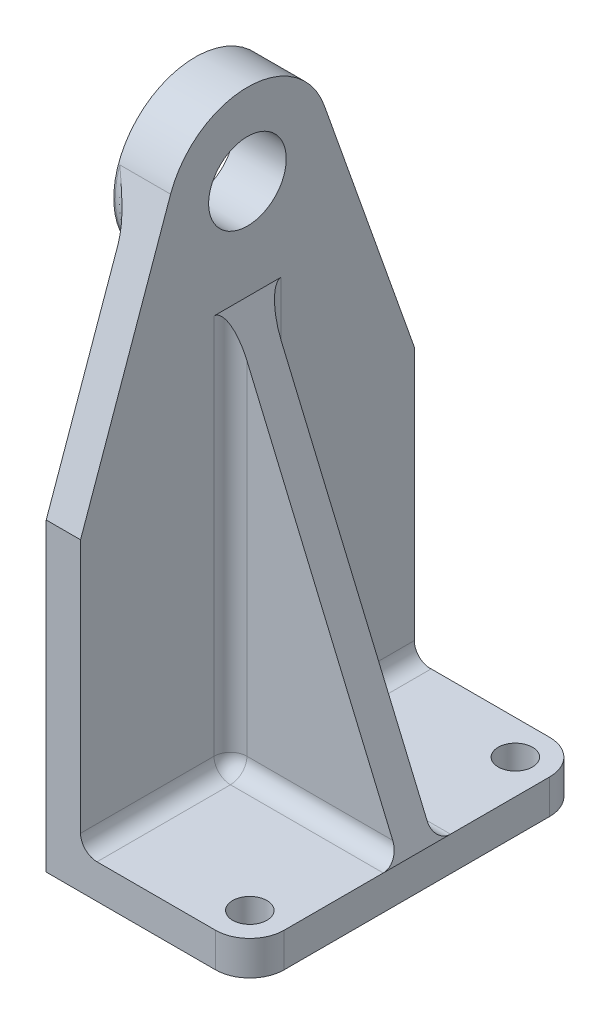
ISO-10303-21;
HEADER;
FILE_DESCRIPTION(('STEP AP214'),'2;1');
FILE_NAME('part.step','',(''),(''),'','','');
FILE_SCHEMA(('AUTOMOTIVE_DESIGN { 1 0 10303 214 1 1 1 1 }'));
ENDSEC;
DATA;
#1=APPLICATION_CONTEXT('core data for automotive mechanical design processes');
#2=APPLICATION_PROTOCOL_DEFINITION('international standard','automotive_design',2000,#1);
#3=PRODUCT_CONTEXT('',#1,'mechanical');
#4=PRODUCT('Part','Part','',(#3));
#5=PRODUCT_RELATED_PRODUCT_CATEGORY('part','',(#4));
#6=PRODUCT_DEFINITION_FORMATION('','',#4);
#7=PRODUCT_DEFINITION_CONTEXT('part definition',#1,'design');
#8=PRODUCT_DEFINITION('design','',#6,#7);
#9=PRODUCT_DEFINITION_SHAPE('','',#8);
#10=(LENGTH_UNIT() NAMED_UNIT(*) SI_UNIT(.MILLI.,.METRE.));
#11=(NAMED_UNIT(*) PLANE_ANGLE_UNIT() SI_UNIT($,.RADIAN.));
#12=(NAMED_UNIT(*) SI_UNIT($,.STERADIAN.) SOLID_ANGLE_UNIT());
#13=UNCERTAINTY_MEASURE_WITH_UNIT(LENGTH_MEASURE(1.E-05),#10,'distance_accuracy_value','');
#14=(GEOMETRIC_REPRESENTATION_CONTEXT(3) GLOBAL_UNCERTAINTY_ASSIGNED_CONTEXT((#13)) GLOBAL_UNIT_ASSIGNED_CONTEXT((#10,
#11,#12)) REPRESENTATION_CONTEXT('',''));
#15=CARTESIAN_POINT('',(0.,0.,0.));
#16=DIRECTION('',(0.,0.,1.));
#17=DIRECTION('',(1.,0.,0.));
#18=AXIS2_PLACEMENT_3D('',#15,#16,#17);
#19=CARTESIAN_POINT('',(0.,54.2408866995074,-15.4414447611668));
#20=DIRECTION('',(1.,0.,0.));
#21=DIRECTION('',(0.,0.,-1.));
#22=AXIS2_PLACEMENT_3D('',#19,#20,#21);
#23=PLANE('',#22);
#24=DIRECTION('',(0.,-1.,0.));
#25=VECTOR('',#24,1.);
#26=CARTESIAN_POINT('',(0.,8.19513172666785,-18.5696596383214));
#27=LINE('',#26,#25);
#28=CARTESIAN_POINT('',(0.,44.9974322852926,-18.5696596383214));
#29=VERTEX_POINT('',#28);
#30=CARTESIAN_POINT('',(0.,9.71913172666785,-18.5696596383214));
#31=VERTEX_POINT('',#30);
#32=EDGE_CURVE('E518',#29,#31,#27,.T.);
#33=ORIENTED_EDGE('',*,*,#32,.T.);
#34=DIRECTION('',(0.,0.,-1.));
#35=VECTOR('',#34,1.);
#36=CARTESIAN_POINT('',(0.,9.71913172666785,-15.4414447611668));
#37=LINE('',#36,#35);
#38=CARTESIAN_POINT('',(0.,9.71913172666785,-30.8828895223335));
#39=VERTEX_POINT('',#38);
#40=EDGE_CURVE('E133',#31,#39,#37,.T.);
#41=ORIENTED_EDGE('',*,*,#40,.T.);
#42=DIRECTION('',(0.,1.,0.));
#43=VECTOR('',#42,1.);
#44=CARTESIAN_POINT('',(0.,5.02013172666785,-30.8828895223335));
#45=LINE('',#44,#43);
#46=CARTESIAN_POINT('',(0.,33.2358374384237,-30.8828895223335));
#47=VERTEX_POINT('',#46);
#48=EDGE_CURVE('E273',#39,#47,#45,.T.);
#49=ORIENTED_EDGE('',*,*,#48,.T.);
#50=DIRECTION('',(0.,0.942603894053774,0.333913010999365));
#51=VECTOR('',#50,1.);
#52=CARTESIAN_POINT('',(0.,33.2358374384237,-30.8828895223335));
#53=LINE('',#52,#51);
#54=CARTESIAN_POINT('',(0.,56.7590271321616,-22.5499098386137));
#55=VERTEX_POINT('',#54);
#56=EDGE_CURVE('E276',#47,#55,#53,.T.);
#57=ORIENTED_EDGE('',*,*,#56,.T.);
#58=CARTESIAN_POINT('',(0.,54.2408866995074,-15.4414447611668));
#59=DIRECTION('',(1.,0.,0.));
#60=DIRECTION('',(0.,0.,-1.));
#61=AXIS2_PLACEMENT_3D('',#58,#59,#60);
#62=CIRCLE('',#61,7.54130671673357);
#63=CARTESIAN_POINT('',(0.,56.7590271321616,-8.33297968371983));
#64=VERTEX_POINT('',#63);
#65=EDGE_CURVE('E279',#55,#64,#62,.T.);
#66=ORIENTED_EDGE('',*,*,#65,.T.);
#67=DIRECTION('',(0.,-0.942603894053773,0.333913010999365));
#68=VECTOR('',#67,1.);
#69=CARTESIAN_POINT('',(0.,33.2358374384237,0.));
#70=LINE('',#69,#68);
#71=CARTESIAN_POINT('',(0.,33.2358374384237,0.));
#72=VERTEX_POINT('',#71);
#73=EDGE_CURVE('E256',#64,#72,#70,.T.);
#74=ORIENTED_EDGE('',*,*,#73,.T.);
#75=DIRECTION('',(0.,-1.,0.));
#76=VECTOR('',#75,1.);
#77=CARTESIAN_POINT('',(0.,33.2358374384237,0.));
#78=LINE('',#77,#76);
#79=CARTESIAN_POINT('',(0.,9.71913172666785,0.));
#80=VERTEX_POINT('',#79);
#81=EDGE_CURVE('E270',#72,#80,#78,.T.);
#82=ORIENTED_EDGE('',*,*,#81,.T.);
#83=DIRECTION('',(0.,0.,-1.));
#84=VECTOR('',#83,1.);
#85=CARTESIAN_POINT('',(0.,9.71913172666785,-15.4414447611668));
#86=LINE('',#85,#84);
#87=CARTESIAN_POINT('',(0.,9.71913172666785,-12.3466596383214));
#88=VERTEX_POINT('',#87);
#89=EDGE_CURVE('E439',#80,#88,#86,.T.);
#90=ORIENTED_EDGE('',*,*,#89,.T.);
#91=DIRECTION('',(0.,-1.,0.));
#92=VECTOR('',#91,1.);
#93=CARTESIAN_POINT('',(0.,54.2408866995074,-12.3466596383214));
#94=LINE('',#93,#92);
#95=CARTESIAN_POINT('',(0.,44.9974322852926,-12.3466596383214));
#96=VERTEX_POINT('',#95);
#97=EDGE_CURVE('E141',#88,#96,#94,.F.);
#98=ORIENTED_EDGE('',*,*,#97,.T.);
#99=DIRECTION('',(0.,0.,-1.));
#100=VECTOR('',#99,1.);
#101=CARTESIAN_POINT('',(0.,44.9974322852926,-13.8706596383214));
#102=LINE('',#101,#100);
#103=EDGE_CURVE('E192',#96,#29,#102,.T.);
#104=ORIENTED_EDGE('',*,*,#103,.T.);
#105=EDGE_LOOP('',(#33,#41,#49,#57,#66,#74,#82,#90,#98,#104));
#106=FACE_BOUND('',#105,.T.);
#107=CARTESIAN_POINT('',(0.,54.2408866995074,-15.4414447611668));
#108=DIRECTION('',(1.,0.,0.));
#109=DIRECTION('',(0.,0.,-1.));
#110=AXIS2_PLACEMENT_3D('',#107,#108,#109);
#111=CIRCLE('',#110,3.58938494369559);
#112=CARTESIAN_POINT('',(0.,54.2408866995074,-19.0308297048624));
#113=VERTEX_POINT('',#112);
#114=EDGE_CURVE('E151',#113,#113,#111,.F.);
#115=ORIENTED_EDGE('',*,*,#114,.T.);
#116=EDGE_LOOP('',(#115));
#117=FACE_BOUND('',#116,.T.);
#118=ADVANCED_FACE('F33',(#106,#117),#23,.T.);
#119=CARTESIAN_POINT('',(-4.826,54.2408866995074,-15.4414447611668));
#120=DIRECTION('',(1.,0.,0.));
#121=DIRECTION('',(0.,0.,-1.));
#122=AXIS2_PLACEMENT_3D('',#119,#120,#121);
#123=PLANE('',#122);
#124=CARTESIAN_POINT('',(-4.826,54.2408866995074,-15.4414447611668));
#125=DIRECTION('',(1.,0.,0.));
#126=DIRECTION('',(0.,0.,-1.));
#127=AXIS2_PLACEMENT_3D('',#124,#125,#126);
#128=CIRCLE('',#127,7.54130671673357);
#129=CARTESIAN_POINT('',(-4.826,54.2408866995074,-22.9827514779003));
#130=VERTEX_POINT('',#129);
#131=EDGE_CURVE('E179',#130,#130,#128,.T.);
#132=ORIENTED_EDGE('',*,*,#131,.F.);
#133=EDGE_LOOP('',(#132));
#134=FACE_BOUND('',#133,.T.);
#135=CARTESIAN_POINT('',(-4.826,54.2408866995074,-15.4414447611668));
#136=DIRECTION('',(1.,0.,0.));
#137=DIRECTION('',(0.,0.,-1.));
#138=AXIS2_PLACEMENT_3D('',#135,#136,#137);
#139=CIRCLE('',#138,3.58938494369559);
#140=CARTESIAN_POINT('',(-4.826,54.2408866995074,-19.0308297048624));
#141=VERTEX_POINT('',#140);
#142=EDGE_CURVE('E37',#141,#141,#139,.F.);
#143=ORIENTED_EDGE('',*,*,#142,.F.);
#144=EDGE_LOOP('',(#143));
#145=FACE_BOUND('',#144,.T.);
#146=ADVANCED_FACE('F358',(#134,#145),#123,.F.);
#147=CARTESIAN_POINT('',(12.4865639503715,8.19513172666785,-27.7413192766428));
#148=DIRECTION('',(0.,-1.,0.));
#149=DIRECTION('',(0.,0.,-1.));
#150=AXIS2_PLACEMENT_3D('',#147,#148,#149);
#151=PLANE('',#150);
#152=CARTESIAN_POINT('',(12.4865639503715,8.19513172666785,-3.175));
#153=DIRECTION('',(0.,-1.,0.));
#154=DIRECTION('',(0.,0.,-1.));
#155=AXIS2_PLACEMENT_3D('',#152,#153,#154);
#156=CIRCLE('',#155,1.5875);
#157=CARTESIAN_POINT('',(12.4865639503715,8.19513172666785,-4.7625));
#158=VERTEX_POINT('',#157);
#159=EDGE_CURVE('E203',#158,#158,#156,.T.);
#160=ORIENTED_EDGE('',*,*,#159,.T.);
#161=EDGE_LOOP('',(#160));
#162=FACE_BOUND('',#161,.T.);
#163=DIRECTION('',(0.,0.,1.));
#164=VECTOR('',#163,1.);
#165=CARTESIAN_POINT('',(15.6615639503715,8.19513172666785,-3.17500000000002));
#166=LINE('',#165,#164);
#167=CARTESIAN_POINT('',(15.6615639503715,8.19513172666785,-12.3466596383214));
#168=VERTEX_POINT('',#167);
#169=CARTESIAN_POINT('',(15.6615639503715,8.19513172666785,-3.17500000000002));
#170=VERTEX_POINT('',#169);
#171=EDGE_CURVE('E219',#168,#170,#166,.T.);
#172=ORIENTED_EDGE('',*,*,#171,.F.);
#173=DIRECTION('',(1.,0.,0.));
#174=VECTOR('',#173,1.);
#175=CARTESIAN_POINT('',(0.,8.19513172666785,-12.3466596383214));
#176=LINE('',#175,#174);
#177=CARTESIAN_POINT('',(1.524,8.19513172666785,-12.3466596383214));
#178=VERTEX_POINT('',#177);
#179=EDGE_CURVE('E58',#168,#178,#176,.F.);
#180=ORIENTED_EDGE('',*,*,#179,.T.);
#181=DIRECTION('',(0.,0.,-1.));
#182=VECTOR('',#181,1.);
#183=CARTESIAN_POINT('',(1.524,8.19513172666785,-27.7413192766428));
#184=LINE('',#183,#182);
#185=CARTESIAN_POINT('',(1.524,8.19513172666785,0.));
#186=VERTEX_POINT('',#185);
#187=EDGE_CURVE('E155',#178,#186,#184,.F.);
#188=ORIENTED_EDGE('',*,*,#187,.T.);
#189=DIRECTION('',(-1.,0.,0.));
#190=VECTOR('',#189,1.);
#191=CARTESIAN_POINT('',(-3.175,8.19513172666785,0.));
#192=LINE('',#191,#190);
#193=CARTESIAN_POINT('',(12.4865639503715,8.19513172666785,0.));
#194=VERTEX_POINT('',#193);
#195=EDGE_CURVE('E225',#194,#186,#192,.T.);
#196=ORIENTED_EDGE('',*,*,#195,.F.);
#197=CARTESIAN_POINT('',(12.4865639503715,8.19513172666785,-3.175));
#198=DIRECTION('',(0.,-1.,0.));
#199=DIRECTION('',(0.,0.,-1.));
#200=AXIS2_PLACEMENT_3D('',#197,#198,#199);
#201=CIRCLE('',#200,3.175);
#202=EDGE_CURVE('E222',#170,#194,#201,.T.);
#203=ORIENTED_EDGE('',*,*,#202,.F.);
#204=EDGE_LOOP('',(#172,#180,#188,#196,#203));
#205=FACE_BOUND('',#204,.T.);
#206=ADVANCED_FACE('F341',(#162,#205),#151,.F.);
#207=CARTESIAN_POINT('',(-3.175,5.02013172666785,-30.8828895223335));
#208=DIRECTION('',(0.,0.,-1.));
#209=DIRECTION('',(-1.,0.,0.));
#210=AXIS2_PLACEMENT_3D('',#207,#208,#209);
#211=PLANE('',#210);
#212=ORIENTED_EDGE('',*,*,#48,.F.);
#213=CARTESIAN_POINT('',(1.524,9.71913172666785,-30.8828895223335));
#214=DIRECTION('',(0.,0.,-1.));
#215=DIRECTION('',(-1.,0.,0.));
#216=AXIS2_PLACEMENT_3D('',#213,#214,#215);
#217=CIRCLE('',#216,1.524);
#218=CARTESIAN_POINT('',(1.524,8.19513172666785,-30.8828895223335));
#219=VERTEX_POINT('',#218);
#220=EDGE_CURVE('E163',#39,#219,#217,.F.);
#221=ORIENTED_EDGE('',*,*,#220,.T.);
#222=DIRECTION('',(-1.,0.,0.));
#223=VECTOR('',#222,1.);
#224=CARTESIAN_POINT('',(-3.175,8.19513172666785,-30.8828895223335));
#225=LINE('',#224,#223);
#226=CARTESIAN_POINT('',(-3.175,8.19513172666785,-30.8828895223335));
#227=VERTEX_POINT('',#226);
#228=EDGE_CURVE('E242',#219,#227,#225,.T.);
#229=ORIENTED_EDGE('',*,*,#228,.T.);
#230=DIRECTION('',(0.,1.,0.));
#231=VECTOR('',#230,1.);
#232=CARTESIAN_POINT('',(-3.175,5.02013172666785,-30.8828895223335));
#233=LINE('',#232,#231);
#234=CARTESIAN_POINT('',(-3.175,33.2358374384237,-30.8828895223335));
#235=VERTEX_POINT('',#234);
#236=EDGE_CURVE('E264',#227,#235,#233,.T.);
#237=ORIENTED_EDGE('',*,*,#236,.T.);
#238=DIRECTION('',(1.,0.,0.));
#239=VECTOR('',#238,1.);
#240=CARTESIAN_POINT('',(-3.175,33.2358374384237,-30.8828895223335));
#241=LINE('',#240,#239);
#242=EDGE_CURVE('E282',#235,#47,#241,.T.);
#243=ORIENTED_EDGE('',*,*,#242,.T.);
#244=EDGE_LOOP('',(#212,#221,#229,#237,#243));
#245=FACE_BOUND('',#244,.T.);
#246=ADVANCED_FACE('F337',(#245),#211,.T.);
#247=CARTESIAN_POINT('',(-3.175,33.2358374384237,0.));
#248=DIRECTION('',(0.,0.333913010999366,0.942603894053774));
#249=DIRECTION('',(0.,-0.942603894053774,0.333913010999366));
#250=AXIS2_PLACEMENT_3D('',#247,#248,#249);
#251=PLANE('',#250);
#252=ORIENTED_EDGE('',*,*,#73,.F.);
#253=DIRECTION('',(1.,0.,0.));
#254=VECTOR('',#253,1.);
#255=CARTESIAN_POINT('',(-3.175,56.7590271321616,-8.33297968371983));
#256=LINE('',#255,#254);
#257=CARTESIAN_POINT('',(-4.699,56.7590271321616,-8.33297968371983));
#258=VERTEX_POINT('',#257);
#259=EDGE_CURVE('E292',#258,#64,#256,.T.);
#260=ORIENTED_EDGE('',*,*,#259,.F.);
#261=CARTESIAN_POINT('',(-3.175,52.0170194715202,-6.65314569816606));
#262=CARTESIAN_POINT('',(-3.17501207440062,52.1049839859188,-6.68430671505687));
#263=CARTESIAN_POINT('',(-3.17763901535099,52.1929205442306,-6.71545782863496));
#264=CARTESIAN_POINT('',(-3.18760079746695,52.3685089624223,-6.77765920270616));
#265=CARTESIAN_POINT('',(-3.19493288920934,52.4561609585406,-6.80870951146107));
#266=CARTESIAN_POINT('',(-3.21375751241296,52.6308054476094,-6.87057650306516));
#267=CARTESIAN_POINT('',(-3.22523813096887,52.7177991080421,-6.90139359948942));
#268=CARTESIAN_POINT('',(-3.25192647457346,52.8912845335693,-6.96284999826705));
#269=CARTESIAN_POINT('',(-3.26713480138338,52.9777762153199,-6.9934892710962));
#270=CARTESIAN_POINT('',(-3.31736642399821,53.2344372355102,-7.08441023439642));
#271=CARTESIAN_POINT('',(-3.35722889481231,53.4037727330466,-7.14439654063613));
#272=CARTESIAN_POINT('',(-3.44735366977153,53.740049576353,-7.26352103607494));
#273=CARTESIAN_POINT('',(-3.49762465925077,53.9069887973582,-7.32265847258603));
#274=CARTESIAN_POINT('',(-3.62714966085169,54.3017800335392,-7.46251141741362));
#275=CARTESIAN_POINT('',(-3.71013875546989,54.5285354319656,-7.542838454387));
#276=CARTESIAN_POINT('',(-3.8870203229728,54.9781386521887,-7.70210828762954));
#277=CARTESIAN_POINT('',(-3.98091230757337,55.2009866484637,-7.78105114570682));
#278=CARTESIAN_POINT('',(-4.2735311583918,55.866736682317,-8.01688997448655));
#279=CARTESIAN_POINT('',(-4.48270170664694,56.3054879407877,-8.17231555114695));
#280=CARTESIAN_POINT('',(-4.69425253711033,56.7490725540293,-8.32945332107868));
#281=CARTESIAN_POINT('',(-4.69662627828367,56.7540498484341,-8.33121650429043));
#282=CARTESIAN_POINT('',(-4.699,56.7590271321616,-8.33297968371983));
#283=B_SPLINE_CURVE_WITH_KNOTS('',3,(#261,#262,#263,#264,#265,#266,#267,#268,#269,#270,#271,
#272,#273,#274,#275,#276,#277,#278,#279,#280,#281,#282),.UNSPECIFIED.,.F.,.F.,(4,2,2,2,2,2,2,2,
2,2,4),(0.,0.279882936805016,0.559602474640391,0.838525071581229,1.11749272448304,
1.6691035906472,2.22117661420261,2.98418183778869,3.74715290348044,5.27765598481972,
5.29502412436331),.UNSPECIFIED.);
#284=CARTESIAN_POINT('',(-3.175,52.0170194715202,-6.65314569816606));
#285=VERTEX_POINT('',#284);
#286=EDGE_CURVE('E319',#258,#285,#283,.F.);
#287=ORIENTED_EDGE('',*,*,#286,.T.);
#288=DIRECTION('',(0.,-0.942603894053773,0.333913010999365));
#289=VECTOR('',#288,1.);
#290=CARTESIAN_POINT('',(-3.175,33.2358374384237,0.));
#291=LINE('',#290,#289);
#292=CARTESIAN_POINT('',(-3.175,33.2358374384237,0.));
#293=VERTEX_POINT('',#292);
#294=EDGE_CURVE('E261',#285,#293,#291,.T.);
#295=ORIENTED_EDGE('',*,*,#294,.T.);
#296=DIRECTION('',(1.,0.,0.));
#297=VECTOR('',#296,1.);
#298=CARTESIAN_POINT('',(-3.175,33.2358374384237,0.));
#299=LINE('',#298,#297);
#300=EDGE_CURVE('E288',#293,#72,#299,.T.);
#301=ORIENTED_EDGE('',*,*,#300,.T.);
#302=EDGE_LOOP('',(#252,#260,#287,#295,#301));
#303=FACE_BOUND('',#302,.T.);
#304=ADVANCED_FACE('F340',(#303),#251,.T.);
#305=CARTESIAN_POINT('',(-3.175,54.2408866995074,-15.4414447611668));
#306=DIRECTION('',(1.,0.,0.));
#307=DIRECTION('',(0.,0.,-1.));
#308=AXIS2_PLACEMENT_3D('',#305,#306,#307);
#309=CYLINDRICAL_SURFACE('',#308,7.54130671673357);
#310=DIRECTION('',(1.,0.,0.));
#311=VECTOR('',#310,1.);
#312=CARTESIAN_POINT('',(-3.175,56.7590271321616,-22.5499098386137));
#313=LINE('',#312,#311);
#314=CARTESIAN_POINT('',(-4.699,56.7590271321616,-22.5499098386137));
#315=VERTEX_POINT('',#314);
#316=EDGE_CURVE('E80',#315,#55,#313,.T.);
#317=ORIENTED_EDGE('',*,*,#316,.F.);
#318=CARTESIAN_POINT('',(-4.699,54.2408866995074,-15.4414447611668));
#319=DIRECTION('',(1.,0.,0.));
#320=DIRECTION('',(0.,0.,-1.));
#321=AXIS2_PLACEMENT_3D('',#318,#319,#320);
#322=CIRCLE('',#321,7.54130671673357);
#323=EDGE_CURVE('E310',#315,#258,#322,.F.);
#324=ORIENTED_EDGE('',*,*,#323,.T.);
#325=ORIENTED_EDGE('',*,*,#259,.T.);
#326=ORIENTED_EDGE('',*,*,#65,.F.);
#327=EDGE_LOOP('',(#317,#324,#325,#326));
#328=FACE_BOUND('',#327,.T.);
#329=ORIENTED_EDGE('',*,*,#131,.T.);
#330=EDGE_LOOP('',(#329));
#331=FACE_BOUND('',#330,.T.);
#332=ADVANCED_FACE('F334',(#328,#331),#309,.T.);
#333=CARTESIAN_POINT('',(-3.175,33.2358374384237,-30.8828895223335));
#334=DIRECTION('',(0.,0.333913010999365,-0.942603894053774));
#335=DIRECTION('',(0.,0.942603894053774,0.333913010999365));
#336=AXIS2_PLACEMENT_3D('',#333,#334,#335);
#337=PLANE('',#336);
#338=ORIENTED_EDGE('',*,*,#56,.F.);
#339=ORIENTED_EDGE('',*,*,#242,.F.);
#340=DIRECTION('',(0.,0.942603894053774,0.333913010999365));
#341=VECTOR('',#340,1.);
#342=CARTESIAN_POINT('',(-3.175,33.2358374384237,-30.8828895223335));
#343=LINE('',#342,#341);
#344=CARTESIAN_POINT('',(-3.175,52.0170194715202,-24.2297438241675));
#345=VERTEX_POINT('',#344);
#346=EDGE_CURVE('E267',#235,#345,#343,.T.);
#347=ORIENTED_EDGE('',*,*,#346,.T.);
#348=CARTESIAN_POINT('',(-3.175,52.0170194715202,-24.2297438241675));
#349=CARTESIAN_POINT('',(-3.17501207440062,52.1049839859186,-24.1985828072767));
#350=CARTESIAN_POINT('',(-3.17763901535097,52.1929205442303,-24.1674316936987));
#351=CARTESIAN_POINT('',(-3.18760079746689,52.3685089624216,-24.1052303196276));
#352=CARTESIAN_POINT('',(-3.19493288920926,52.4561609585397,-24.0741800108728));
#353=CARTESIAN_POINT('',(-3.21375751241281,52.6308054476082,-24.0123130192688));
#354=CARTESIAN_POINT('',(-3.22523813096869,52.7177991080407,-23.9814959228446));
#355=CARTESIAN_POINT('',(-3.25192647457319,52.8912845335677,-23.9200395240671));
#356=CARTESIAN_POINT('',(-3.26713480138306,52.9777762153182,-23.8894002512379));
#357=CARTESIAN_POINT('',(-3.31736642399786,53.2344372355087,-23.7984792879376));
#358=CARTESIAN_POINT('',(-3.35722889481199,53.4037727330454,-23.7384929816978));
#359=CARTESIAN_POINT('',(-3.44735366977137,53.7400495763524,-23.6193684862588));
#360=CARTESIAN_POINT('',(-3.49762465925073,53.9069887973579,-23.5602310497476));
#361=CARTESIAN_POINT('',(-3.62714966085163,54.3017800335393,-23.4203781049199));
#362=CARTESIAN_POINT('',(-3.71013875546961,54.5285354319658,-23.3400510679465));
#363=CARTESIAN_POINT('',(-3.88702032297319,54.9781386521888,-23.180781234704));
#364=CARTESIAN_POINT('',(-3.98091230757466,55.2009866484636,-23.1018383766268));
#365=CARTESIAN_POINT('',(-4.27353115838966,55.8667366823183,-22.8659995478465));
#366=CARTESIAN_POINT('',(-4.48270170663444,56.3054879407932,-22.7105739711845));
#367=CARTESIAN_POINT('',(-4.69425253711006,56.7490725540295,-22.5534362012548));
#368=CARTESIAN_POINT('',(-4.69662627828354,56.7540498484342,-22.5516730180431));
#369=CARTESIAN_POINT('',(-4.699,56.7590271321616,-22.5499098386137));
#370=B_SPLINE_CURVE_WITH_KNOTS('',3,(#348,#349,#350,#351,#352,#353,#354,#355,#356,#357,#358,
#359,#360,#361,#362,#363,#364,#365,#366,#367,#368,#369),.UNSPECIFIED.,.F.,.F.,(4,2,2,2,2,2,2,2,
2,2,4),(0.,0.279882936804461,0.559602474639271,0.838525071579672,1.11749272448104,
1.66910359064626,2.22117661420262,2.98418183778883,3.74715290348096,5.27765598481981,
5.29502412436333),.UNSPECIFIED.);
#371=EDGE_CURVE('E312',#345,#315,#370,.T.);
#372=ORIENTED_EDGE('',*,*,#371,.T.);
#373=ORIENTED_EDGE('',*,*,#316,.T.);
#374=EDGE_LOOP('',(#338,#339,#347,#372,#373));
#375=FACE_BOUND('',#374,.T.);
#376=ADVANCED_FACE('F328',(#375),#337,.T.);
#377=CARTESIAN_POINT('',(-3.175,5.02013172666785,0.));
#378=DIRECTION('',(0.,-1.,0.));
#379=DIRECTION('',(0.,0.,-1.));
#380=AXIS2_PLACEMENT_3D('',#377,#378,#379);
#381=PLANE('',#380);
#382=DIRECTION('',(0.,0.,-1.));
#383=VECTOR('',#382,1.);
#384=CARTESIAN_POINT('',(-3.175,5.02013172666785,0.));
#385=LINE('',#384,#383);
#386=CARTESIAN_POINT('',(-3.175,5.02013172666785,0.));
#387=VERTEX_POINT('',#386);
#388=CARTESIAN_POINT('',(-3.175,5.02013172666785,-30.9163192766428));
#389=VERTEX_POINT('',#388);
#390=EDGE_CURVE('E260',#387,#389,#385,.T.);
#391=ORIENTED_EDGE('',*,*,#390,.T.);
#392=DIRECTION('',(1.,0.,0.));
#393=VECTOR('',#392,1.);
#394=CARTESIAN_POINT('',(-3.175,5.02013172666785,-30.9163192766428));
#395=LINE('',#394,#393);
#396=CARTESIAN_POINT('',(12.4865639503715,5.02013172666785,-30.9163192766428));
#397=VERTEX_POINT('',#396);
#398=EDGE_CURVE('E206',#389,#397,#395,.T.);
#399=ORIENTED_EDGE('',*,*,#398,.T.);
#400=CARTESIAN_POINT('',(12.4865639503715,5.02013172666785,-27.7413192766428));
#401=DIRECTION('',(0.,-1.,0.));
#402=DIRECTION('',(0.,0.,-1.));
#403=AXIS2_PLACEMENT_3D('',#400,#401,#402);
#404=CIRCLE('',#403,3.175);
#405=CARTESIAN_POINT('',(15.6615639503715,5.02013172666785,-27.7413192766427));
#406=VERTEX_POINT('',#405);
#407=EDGE_CURVE('E231',#397,#406,#404,.T.);
#408=ORIENTED_EDGE('',*,*,#407,.T.);
#409=DIRECTION('',(0.,0.,1.));
#410=VECTOR('',#409,1.);
#411=CARTESIAN_POINT('',(15.6615639503715,5.02013172666785,-3.17500000000002));
#412=LINE('',#411,#410);
#413=CARTESIAN_POINT('',(15.6615639503715,5.02013172666785,-3.17500000000002));
#414=VERTEX_POINT('',#413);
#415=EDGE_CURVE('E234',#406,#414,#412,.T.);
#416=ORIENTED_EDGE('',*,*,#415,.T.);
#417=CARTESIAN_POINT('',(12.4865639503715,5.02013172666785,-3.175));
#418=DIRECTION('',(0.,-1.,0.));
#419=DIRECTION('',(0.,0.,-1.));
#420=AXIS2_PLACEMENT_3D('',#417,#418,#419);
#421=CIRCLE('',#420,3.175);
#422=CARTESIAN_POINT('',(12.4865639503715,5.02013172666785,0.));
#423=VERTEX_POINT('',#422);
#424=EDGE_CURVE('E213',#414,#423,#421,.T.);
#425=ORIENTED_EDGE('',*,*,#424,.T.);
#426=DIRECTION('',(1.,0.,0.));
#427=VECTOR('',#426,1.);
#428=CARTESIAN_POINT('',(-3.175,5.02013172666785,0.));
#429=LINE('',#428,#427);
#430=EDGE_CURVE('E285',#387,#423,#429,.T.);
#431=ORIENTED_EDGE('',*,*,#430,.F.);
#432=EDGE_LOOP('',(#391,#399,#408,#416,#425,#431));
#433=FACE_BOUND('',#432,.T.);
#434=CARTESIAN_POINT('',(12.4865639503715,5.02013172666785,-27.7413192766428));
#435=DIRECTION('',(0.,-1.,0.));
#436=DIRECTION('',(0.,0.,-1.));
#437=AXIS2_PLACEMENT_3D('',#434,#435,#436);
#438=CIRCLE('',#437,1.5875);
#439=CARTESIAN_POINT('',(12.4865639503715,5.02013172666785,-29.3288192766428));
#440=VERTEX_POINT('',#439);
#441=EDGE_CURVE('E196',#440,#440,#438,.T.);
#442=ORIENTED_EDGE('',*,*,#441,.F.);
#443=EDGE_LOOP('',(#442));
#444=FACE_BOUND('',#443,.T.);
#445=CARTESIAN_POINT('',(12.4865639503715,5.02013172666785,-3.175));
#446=DIRECTION('',(0.,-1.,0.));
#447=DIRECTION('',(0.,0.,-1.));
#448=AXIS2_PLACEMENT_3D('',#445,#446,#447);
#449=CIRCLE('',#448,1.5875);
#450=CARTESIAN_POINT('',(12.4865639503715,5.02013172666785,-4.7625));
#451=VERTEX_POINT('',#450);
#452=EDGE_CURVE('E200',#451,#451,#449,.T.);
#453=ORIENTED_EDGE('',*,*,#452,.F.);
#454=EDGE_LOOP('',(#453));
#455=FACE_BOUND('',#454,.T.);
#456=ADVANCED_FACE('F333',(#433,#444,#455),#381,.T.);
#457=CARTESIAN_POINT('',(-3.175,33.2358374384237,0.));
#458=DIRECTION('',(0.,0.,1.));
#459=DIRECTION('',(1.,0.,0.));
#460=AXIS2_PLACEMENT_3D('',#457,#458,#459);
#461=PLANE('',#460);
#462=ORIENTED_EDGE('',*,*,#195,.T.);
#463=CARTESIAN_POINT('',(1.524,9.71913172666785,0.));
#464=DIRECTION('',(0.,0.,1.));
#465=DIRECTION('',(1.,0.,0.));
#466=AXIS2_PLACEMENT_3D('',#463,#464,#465);
#467=CIRCLE('',#466,1.524);
#468=EDGE_CURVE('E42',#186,#80,#467,.F.);
#469=ORIENTED_EDGE('',*,*,#468,.T.);
#470=ORIENTED_EDGE('',*,*,#81,.F.);
#471=ORIENTED_EDGE('',*,*,#300,.F.);
#472=DIRECTION('',(0.,-1.,0.));
#473=VECTOR('',#472,1.);
#474=CARTESIAN_POINT('',(-3.175,33.2358374384237,0.));
#475=LINE('',#474,#473);
#476=EDGE_CURVE('E257',#293,#387,#475,.T.);
#477=ORIENTED_EDGE('',*,*,#476,.T.);
#478=ORIENTED_EDGE('',*,*,#430,.T.);
#479=DIRECTION('',(0.,-1.,0.));
#480=VECTOR('',#479,1.);
#481=CARTESIAN_POINT('',(12.4865639503715,8.19513172666785,0.));
#482=LINE('',#481,#480);
#483=EDGE_CURVE('E239',#194,#423,#482,.T.);
#484=ORIENTED_EDGE('',*,*,#483,.F.);
#485=EDGE_LOOP('',(#462,#469,#470,#471,#477,#478,#484));
#486=FACE_BOUND('',#485,.T.);
#487=ADVANCED_FACE('F345',(#486),#461,.T.);
#488=CARTESIAN_POINT('',(-3.175,54.2408866995074,-15.4414447611668));
#489=DIRECTION('',(1.,0.,0.));
#490=DIRECTION('',(0.,0.,-1.));
#491=AXIS2_PLACEMENT_3D('',#488,#489,#490);
#492=PLANE('',#491);
#493=ORIENTED_EDGE('',*,*,#294,.F.);
#494=CARTESIAN_POINT('',(-3.175,54.2408866995074,-15.4414447611668));
#495=DIRECTION('',(1.,0.,0.));
#496=DIRECTION('',(0.,0.,-1.));
#497=AXIS2_PLACEMENT_3D('',#494,#495,#496);
#498=CIRCLE('',#497,9.06530671673356);
#499=EDGE_CURVE('E301',#285,#345,#498,.T.);
#500=ORIENTED_EDGE('',*,*,#499,.T.);
#501=ORIENTED_EDGE('',*,*,#346,.F.);
#502=ORIENTED_EDGE('',*,*,#236,.F.);
#503=DIRECTION('',(0.,0.,-1.));
#504=VECTOR('',#503,1.);
#505=CARTESIAN_POINT('',(-3.175,8.19513172666785,0.));
#506=LINE('',#505,#504);
#507=CARTESIAN_POINT('',(-3.175,8.19513172666785,-30.9163192766428));
#508=VERTEX_POINT('',#507);
#509=EDGE_CURVE('E209',#227,#508,#506,.T.);
#510=ORIENTED_EDGE('',*,*,#509,.T.);
#511=DIRECTION('',(0.,-1.,0.));
#512=VECTOR('',#511,1.);
#513=CARTESIAN_POINT('',(-3.175,8.19513172666785,-30.9163192766428));
#514=LINE('',#513,#512);
#515=EDGE_CURVE('E228',#508,#389,#514,.T.);
#516=ORIENTED_EDGE('',*,*,#515,.T.);
#517=ORIENTED_EDGE('',*,*,#390,.F.);
#518=ORIENTED_EDGE('',*,*,#476,.F.);
#519=EDGE_LOOP('',(#493,#500,#501,#502,#510,#516,#517,#518));
#520=FACE_BOUND('',#519,.T.);
#521=ADVANCED_FACE('F348',(#520),#492,.F.);
#522=CARTESIAN_POINT('',(12.4865639503715,8.19513172666785,-3.175));
#523=DIRECTION('',(0.,-1.,0.));
#524=DIRECTION('',(0.,0.,-1.));
#525=AXIS2_PLACEMENT_3D('',#522,#523,#524);
#526=CYLINDRICAL_SURFACE('',#525,3.175);
#527=ORIENTED_EDGE('',*,*,#424,.F.);
#528=DIRECTION('',(0.,-1.,0.));
#529=VECTOR('',#528,1.);
#530=CARTESIAN_POINT('',(15.6615639503715,8.19513172666785,-3.17500000000002));
#531=LINE('',#530,#529);
#532=EDGE_CURVE('E243',#170,#414,#531,.T.);
#533=ORIENTED_EDGE('',*,*,#532,.F.);
#534=ORIENTED_EDGE('',*,*,#202,.T.);
#535=ORIENTED_EDGE('',*,*,#483,.T.);
#536=EDGE_LOOP('',(#527,#533,#534,#535));
#537=FACE_BOUND('',#536,.T.);
#538=ADVANCED_FACE('F369',(#537),#526,.T.);
#539=CARTESIAN_POINT('',(15.6615639503715,8.19513172666785,-3.17500000000002));
#540=DIRECTION('',(1.,0.,0.));
#541=DIRECTION('',(0.,0.,-1.));
#542=AXIS2_PLACEMENT_3D('',#539,#540,#541);
#543=PLANE('',#542);
#544=ORIENTED_EDGE('',*,*,#415,.F.);
#545=DIRECTION('',(0.,-1.,0.));
#546=VECTOR('',#545,1.);
#547=CARTESIAN_POINT('',(15.6615639503715,8.19513172666785,-27.7413192766427));
#548=LINE('',#547,#546);
#549=CARTESIAN_POINT('',(15.6615639503715,8.19513172666785,-27.7413192766427));
#550=VERTEX_POINT('',#549);
#551=EDGE_CURVE('E246',#550,#406,#548,.T.);
#552=ORIENTED_EDGE('',*,*,#551,.F.);
#553=CARTESIAN_POINT('',(15.6615639503715,8.19513172666785,-18.5696596383214));
#554=VERTEX_POINT('',#553);
#555=EDGE_CURVE('E220',#550,#554,#166,.T.);
#556=ORIENTED_EDGE('',*,*,#555,.T.);
#557=DIRECTION('',(0.,0.,-1.));
#558=VECTOR('',#557,1.);
#559=CARTESIAN_POINT('',(15.6615639503715,8.19513172666785,-13.8706596383214));
#560=LINE('',#559,#558);
#561=EDGE_CURVE('E50',#168,#554,#560,.T.);
#562=ORIENTED_EDGE('',*,*,#561,.F.);
#563=ORIENTED_EDGE('',*,*,#171,.T.);
#564=ORIENTED_EDGE('',*,*,#532,.T.);
#565=EDGE_LOOP('',(#544,#552,#556,#562,#563,#564));
#566=FACE_BOUND('',#565,.T.);
#567=ADVANCED_FACE('F379',(#566),#543,.T.);
#568=CARTESIAN_POINT('',(12.4865639503715,8.19513172666785,-27.7413192766428));
#569=DIRECTION('',(0.,-1.,0.));
#570=DIRECTION('',(0.,0.,-1.));
#571=AXIS2_PLACEMENT_3D('',#568,#569,#570);
#572=CYLINDRICAL_SURFACE('',#571,3.175);
#573=ORIENTED_EDGE('',*,*,#407,.F.);
#574=DIRECTION('',(0.,-1.,0.));
#575=VECTOR('',#574,1.);
#576=CARTESIAN_POINT('',(12.4865639503715,8.19513172666785,-30.9163192766428));
#577=LINE('',#576,#575);
#578=CARTESIAN_POINT('',(12.4865639503715,8.19513172666785,-30.9163192766428));
#579=VERTEX_POINT('',#578);
#580=EDGE_CURVE('E249',#579,#397,#577,.T.);
#581=ORIENTED_EDGE('',*,*,#580,.F.);
#582=CARTESIAN_POINT('',(12.4865639503715,8.19513172666785,-27.7413192766428));
#583=DIRECTION('',(0.,-1.,0.));
#584=DIRECTION('',(0.,0.,-1.));
#585=AXIS2_PLACEMENT_3D('',#582,#583,#584);
#586=CIRCLE('',#585,3.175);
#587=EDGE_CURVE('E216',#579,#550,#586,.T.);
#588=ORIENTED_EDGE('',*,*,#587,.T.);
#589=ORIENTED_EDGE('',*,*,#551,.T.);
#590=EDGE_LOOP('',(#573,#581,#588,#589));
#591=FACE_BOUND('',#590,.T.);
#592=ADVANCED_FACE('F375',(#591),#572,.T.);
#593=CARTESIAN_POINT('',(-3.175,8.19513172666785,-30.9163192766428));
#594=DIRECTION('',(0.,0.,-1.));
#595=DIRECTION('',(-1.,0.,0.));
#596=AXIS2_PLACEMENT_3D('',#593,#594,#595);
#597=PLANE('',#596);
#598=ORIENTED_EDGE('',*,*,#398,.F.);
#599=ORIENTED_EDGE('',*,*,#515,.F.);
#600=DIRECTION('',(1.,0.,0.));
#601=VECTOR('',#600,1.);
#602=CARTESIAN_POINT('',(-3.175,8.19513172666785,-30.9163192766428));
#603=LINE('',#602,#601);
#604=EDGE_CURVE('E212',#508,#579,#603,.T.);
#605=ORIENTED_EDGE('',*,*,#604,.T.);
#606=ORIENTED_EDGE('',*,*,#580,.T.);
#607=EDGE_LOOP('',(#598,#599,#605,#606));
#608=FACE_BOUND('',#607,.T.);
#609=ADVANCED_FACE('F371',(#608),#597,.T.);
#610=DIRECTION('',(0.,0.,-1.));
#611=VECTOR('',#610,1.);
#612=CARTESIAN_POINT('',(1.524,8.19513172666785,-27.7413192766428));
#613=LINE('',#612,#611);
#614=CARTESIAN_POINT('',(1.524,8.19513172666785,-18.5696596383214));
#615=VERTEX_POINT('',#614);
#616=EDGE_CURVE('E534',#219,#615,#613,.F.);
#617=ORIENTED_EDGE('',*,*,#616,.T.);
#618=DIRECTION('',(1.,0.,0.));
#619=VECTOR('',#618,1.);
#620=CARTESIAN_POINT('',(12.4865639503715,8.19513172666785,-18.5696596383214));
#621=LINE('',#620,#619);
#622=EDGE_CURVE('E533',#615,#554,#621,.T.);
#623=ORIENTED_EDGE('',*,*,#622,.T.);
#624=ORIENTED_EDGE('',*,*,#555,.F.);
#625=ORIENTED_EDGE('',*,*,#587,.F.);
#626=ORIENTED_EDGE('',*,*,#604,.F.);
#627=ORIENTED_EDGE('',*,*,#509,.F.);
#628=ORIENTED_EDGE('',*,*,#228,.F.);
#629=EDGE_LOOP('',(#617,#623,#624,#625,#626,#627,#628));
#630=FACE_BOUND('',#629,.T.);
#631=CARTESIAN_POINT('',(12.4865639503715,8.19513172666785,-27.7413192766428));
#632=DIRECTION('',(0.,-1.,0.));
#633=DIRECTION('',(0.,0.,-1.));
#634=AXIS2_PLACEMENT_3D('',#631,#632,#633);
#635=CIRCLE('',#634,1.5875);
#636=CARTESIAN_POINT('',(12.4865639503715,8.19513172666785,-29.3288192766428));
#637=VERTEX_POINT('',#636);
#638=EDGE_CURVE('E197',#637,#637,#635,.T.);
#639=ORIENTED_EDGE('',*,*,#638,.T.);
#640=EDGE_LOOP('',(#639));
#641=FACE_BOUND('',#640,.T.);
#642=ADVANCED_FACE('F374',(#630,#641),#151,.F.);
#643=CARTESIAN_POINT('',(12.4865639503715,8.19513172666785,-3.175));
#644=DIRECTION('',(0.,-1.,0.));
#645=DIRECTION('',(0.,0.,-1.));
#646=AXIS2_PLACEMENT_3D('',#643,#644,#645);
#647=CYLINDRICAL_SURFACE('',#646,1.5875);
#648=ORIENTED_EDGE('',*,*,#159,.F.);
#649=EDGE_LOOP('',(#648));
#650=FACE_BOUND('',#649,.T.);
#651=ORIENTED_EDGE('',*,*,#452,.T.);
#652=EDGE_LOOP('',(#651));
#653=FACE_BOUND('',#652,.T.);
#654=ADVANCED_FACE('F388',(#650,#653),#647,.F.);
#655=CARTESIAN_POINT('',(12.4865639503715,8.19513172666785,-27.7413192766428));
#656=DIRECTION('',(0.,-1.,0.));
#657=DIRECTION('',(0.,0.,-1.));
#658=AXIS2_PLACEMENT_3D('',#655,#656,#657);
#659=CYLINDRICAL_SURFACE('',#658,1.5875);
#660=ORIENTED_EDGE('',*,*,#638,.F.);
#661=EDGE_LOOP('',(#660));
#662=FACE_BOUND('',#661,.T.);
#663=ORIENTED_EDGE('',*,*,#441,.T.);
#664=EDGE_LOOP('',(#663));
#665=FACE_BOUND('',#664,.T.);
#666=ADVANCED_FACE('F392',(#662,#665),#659,.F.);
#667=CARTESIAN_POINT('',(15.6615639503715,8.19513172666785,-13.8706596383214));
#668=DIRECTION('',(-0.920145532459529,-0.391576555854368,0.));
#669=DIRECTION('',(0.391576555854368,-0.920145532459529,0.));
#670=AXIS2_PLACEMENT_3D('',#667,#668,#669);
#671=PLANE('',#670);
#672=ORIENTED_EDGE('',*,*,#561,.T.);
#673=CARTESIAN_POINT('',(15.0130114659326,9.71913172666785,-18.5696596383214));
#674=DIRECTION('',(-0.920145532459529,-0.391576555854368,0.));
#675=DIRECTION('',(0.391576555854368,-0.920145532459529,0.));
#676=AXIS2_PLACEMENT_3D('',#673,#674,#675);
#677=ELLIPSE('',#676,1.65625973961573,1.524);
#678=CARTESIAN_POINT('',(15.0130114659326,9.71913172666785,-17.0456596383214));
#679=VERTEX_POINT('',#678);
#680=EDGE_CURVE('E161',#554,#679,#677,.T.);
#681=ORIENTED_EDGE('',*,*,#680,.T.);
#682=DIRECTION('',(-0.391576555854368,0.920145532459529,0.));
#683=VECTOR('',#682,1.);
#684=CARTESIAN_POINT('',(15.6615639503715,8.19513172666785,-17.0456596383214));
#685=LINE('',#684,#683);
#686=CARTESIAN_POINT('',(1.524,41.4162633656961,-17.0456596383214));
#687=VERTEX_POINT('',#686);
#688=EDGE_CURVE('E184',#679,#687,#685,.T.);
#689=ORIENTED_EDGE('',*,*,#688,.T.);
#690=CARTESIAN_POINT('',(1.524,41.4162633656961,-18.5696596383214));
#691=DIRECTION('',(-0.920145532459529,-0.391576555854368,0.));
#692=DIRECTION('',(-0.391576555854368,0.920145532459529,0.));
#693=AXIS2_PLACEMENT_3D('',#690,#691,#692);
#694=ELLIPSE('',#693,3.89195925347173,1.524);
#695=EDGE_CURVE('E166',#687,#29,#694,.T.);
#696=ORIENTED_EDGE('',*,*,#695,.T.);
#697=ORIENTED_EDGE('',*,*,#103,.F.);
#698=CARTESIAN_POINT('',(1.524,41.4162633656961,-12.3466596383214));
#699=DIRECTION('',(-0.920145532459529,-0.391576555854368,0.));
#700=DIRECTION('',(0.391576555854368,-0.920145532459529,0.));
#701=AXIS2_PLACEMENT_3D('',#698,#699,#700);
#702=ELLIPSE('',#701,3.89195925347173,1.524);
#703=CARTESIAN_POINT('',(1.524,41.4162633656961,-13.8706596383214));
#704=VERTEX_POINT('',#703);
#705=EDGE_CURVE('E11',#96,#704,#702,.T.);
#706=ORIENTED_EDGE('',*,*,#705,.T.);
#707=DIRECTION('',(-0.391576555854368,0.920145532459529,0.));
#708=VECTOR('',#707,1.);
#709=CARTESIAN_POINT('',(15.6615639503715,8.19513172666785,-13.8706596383214));
#710=LINE('',#709,#708);
#711=CARTESIAN_POINT('',(15.0130114659326,9.71913172666785,-13.8706596383214));
#712=VERTEX_POINT('',#711);
#713=EDGE_CURVE('E130',#712,#704,#710,.T.);
#714=ORIENTED_EDGE('',*,*,#713,.F.);
#715=CARTESIAN_POINT('',(15.0130114659326,9.71913172666785,-12.3466596383214));
#716=DIRECTION('',(-0.920145532459529,-0.391576555854368,0.));
#717=DIRECTION('',(-0.391576555854368,0.920145532459529,0.));
#718=AXIS2_PLACEMENT_3D('',#715,#716,#717);
#719=ELLIPSE('',#718,1.65625973961573,1.524);
#720=EDGE_CURVE('E154',#712,#168,#719,.T.);
#721=ORIENTED_EDGE('',*,*,#720,.T.);
#722=EDGE_LOOP('',(#672,#681,#689,#696,#697,#706,#714,#721));
#723=FACE_BOUND('',#722,.T.);
#724=ADVANCED_FACE('F396',(#723),#671,.F.);
#725=CARTESIAN_POINT('',(0.,8.19513172666785,-13.8706596383214));
#726=DIRECTION('',(0.,0.,-1.));
#727=DIRECTION('',(-1.,0.,0.));
#728=AXIS2_PLACEMENT_3D('',#725,#726,#727);
#729=PLANE('',#728);
#730=DIRECTION('',(0.,-1.,0.));
#731=VECTOR('',#730,1.);
#732=CARTESIAN_POINT('',(1.524,8.19513172666785,-13.8706596383214));
#733=LINE('',#732,#731);
#734=CARTESIAN_POINT('',(1.524,9.71913172666785,-13.8706596383214));
#735=VERTEX_POINT('',#734);
#736=EDGE_CURVE('E124',#704,#735,#733,.T.);
#737=ORIENTED_EDGE('',*,*,#736,.T.);
#738=DIRECTION('',(1.,0.,0.));
#739=VECTOR('',#738,1.);
#740=CARTESIAN_POINT('',(15.6615639503715,9.71913172666785,-13.8706596383214));
#741=LINE('',#740,#739);
#742=EDGE_CURVE('E128',#735,#712,#741,.T.);
#743=ORIENTED_EDGE('',*,*,#742,.T.);
#744=ORIENTED_EDGE('',*,*,#713,.T.);
#745=EDGE_LOOP('',(#737,#743,#744));
#746=FACE_BOUND('',#745,.T.);
#747=ADVANCED_FACE('F126',(#746),#729,.F.);
#748=CARTESIAN_POINT('',(0.,8.19513172666785,-17.0456596383214));
#749=DIRECTION('',(0.,0.,-1.));
#750=DIRECTION('',(-1.,0.,0.));
#751=AXIS2_PLACEMENT_3D('',#748,#749,#750);
#752=PLANE('',#751);
#753=ORIENTED_EDGE('',*,*,#688,.F.);
#754=DIRECTION('',(1.,0.,0.));
#755=VECTOR('',#754,1.);
#756=CARTESIAN_POINT('',(0.,9.71913172666785,-17.0456596383214));
#757=LINE('',#756,#755);
#758=CARTESIAN_POINT('',(1.524,9.71913172666785,-17.0456596383214));
#759=VERTEX_POINT('',#758);
#760=EDGE_CURVE('E516',#679,#759,#757,.F.);
#761=ORIENTED_EDGE('',*,*,#760,.T.);
#762=DIRECTION('',(0.,-1.,0.));
#763=VECTOR('',#762,1.);
#764=CARTESIAN_POINT('',(1.524,44.9974322852926,-17.0456596383214));
#765=LINE('',#764,#763);
#766=EDGE_CURVE('E520',#759,#687,#765,.F.);
#767=ORIENTED_EDGE('',*,*,#766,.T.);
#768=EDGE_LOOP('',(#753,#761,#767));
#769=FACE_BOUND('',#768,.T.);
#770=ADVANCED_FACE('F400',(#769),#752,.T.);
#771=CARTESIAN_POINT('',(-4.699,54.2408866995074,-15.4414447611668));
#772=DIRECTION('',(1.,0.,0.));
#773=DIRECTION('',(0.,0.,-1.));
#774=AXIS2_PLACEMENT_3D('',#771,#772,#773);
#775=TOROIDAL_SURFACE('',#774,9.06530671673356,1.524);
#776=ORIENTED_EDGE('',*,*,#286,.F.);
#777=ORIENTED_EDGE('',*,*,#323,.F.);
#778=ORIENTED_EDGE('',*,*,#371,.F.);
#779=ORIENTED_EDGE('',*,*,#499,.F.);
#780=EDGE_LOOP('',(#776,#777,#778,#779));
#781=FACE_BOUND('',#780,.T.);
#782=ADVANCED_FACE('F325',(#781),#775,.F.);
#783=CARTESIAN_POINT('',(1.524,54.2408866995074,-18.5696596383214));
#784=DIRECTION('',(0.,1.,0.));
#785=DIRECTION('',(0.,0.,1.));
#786=AXIS2_PLACEMENT_3D('',#783,#784,#785);
#787=CYLINDRICAL_SURFACE('',#786,1.524);
#788=ORIENTED_EDGE('',*,*,#695,.F.);
#789=ORIENTED_EDGE('',*,*,#766,.F.);
#790=CARTESIAN_POINT('',(1.524,9.71913172666785,-18.5696596383214));
#791=DIRECTION('',(0.,1.,0.));
#792=DIRECTION('',(0.,0.,1.));
#793=AXIS2_PLACEMENT_3D('',#790,#791,#792);
#794=CIRCLE('',#793,1.524);
#795=EDGE_CURVE('E177',#31,#759,#794,.T.);
#796=ORIENTED_EDGE('',*,*,#795,.F.);
#797=ORIENTED_EDGE('',*,*,#32,.F.);
#798=EDGE_LOOP('',(#788,#789,#796,#797));
#799=FACE_BOUND('',#798,.T.);
#800=ADVANCED_FACE('F424',(#799),#787,.F.);
#801=CARTESIAN_POINT('',(1.524,9.71913172666785,-15.4414447611668));
#802=DIRECTION('',(0.,0.,-1.));
#803=DIRECTION('',(-1.,0.,0.));
#804=AXIS2_PLACEMENT_3D('',#801,#802,#803);
#805=CYLINDRICAL_SURFACE('',#804,1.524);
#806=ORIENTED_EDGE('',*,*,#220,.F.);
#807=ORIENTED_EDGE('',*,*,#40,.F.);
#808=CARTESIAN_POINT('',(1.524,9.71913172666785,-18.5696596383214));
#809=DIRECTION('',(0.,0.,-1.));
#810=DIRECTION('',(-1.,0.,0.));
#811=AXIS2_PLACEMENT_3D('',#808,#809,#810);
#812=CIRCLE('',#811,1.524);
#813=EDGE_CURVE('E174',#615,#31,#812,.T.);
#814=ORIENTED_EDGE('',*,*,#813,.F.);
#815=ORIENTED_EDGE('',*,*,#616,.F.);
#816=EDGE_LOOP('',(#806,#807,#814,#815));
#817=FACE_BOUND('',#816,.T.);
#818=ADVANCED_FACE('F527',(#817),#805,.F.);
#819=CARTESIAN_POINT('',(1.524,9.71913172666785,-18.5696596383214));
#820=DIRECTION('',(0.,0.,1.));
#821=DIRECTION('',(1.,0.,0.));
#822=AXIS2_PLACEMENT_3D('',#819,#820,#821);
#823=SPHERICAL_SURFACE('',#822,1.524);
#824=ORIENTED_EDGE('',*,*,#813,.T.);
#825=ORIENTED_EDGE('',*,*,#795,.T.);
#826=CARTESIAN_POINT('',(1.524,9.71913172666785,-18.5696596383214));
#827=DIRECTION('',(1.,0.,0.));
#828=DIRECTION('',(0.,0.,-1.));
#829=AXIS2_PLACEMENT_3D('',#826,#827,#828);
#830=CIRCLE('',#829,1.524);
#831=EDGE_CURVE('E171',#615,#759,#830,.F.);
#832=ORIENTED_EDGE('',*,*,#831,.F.);
#833=EDGE_LOOP('',(#824,#825,#832));
#834=FACE_BOUND('',#833,.T.);
#835=ADVANCED_FACE('F435',(#834),#823,.F.);
#836=CARTESIAN_POINT('',(12.4865639503715,9.71913172666785,-18.5696596383214));
#837=DIRECTION('',(1.,0.,0.));
#838=DIRECTION('',(0.,0.,-1.));
#839=AXIS2_PLACEMENT_3D('',#836,#837,#838);
#840=CYLINDRICAL_SURFACE('',#839,1.524);
#841=ORIENTED_EDGE('',*,*,#831,.T.);
#842=ORIENTED_EDGE('',*,*,#760,.F.);
#843=ORIENTED_EDGE('',*,*,#680,.F.);
#844=ORIENTED_EDGE('',*,*,#622,.F.);
#845=EDGE_LOOP('',(#841,#842,#843,#844));
#846=FACE_BOUND('',#845,.T.);
#847=ADVANCED_FACE('F430',(#846),#840,.F.);
#848=CARTESIAN_POINT('',(1.524,9.71913172666785,-15.4414447611668));
#849=DIRECTION('',(0.,0.,-1.));
#850=DIRECTION('',(-1.,0.,0.));
#851=AXIS2_PLACEMENT_3D('',#848,#849,#850);
#852=CYLINDRICAL_SURFACE('',#851,1.524);
#853=ORIENTED_EDGE('',*,*,#468,.F.);
#854=ORIENTED_EDGE('',*,*,#187,.F.);
#855=CARTESIAN_POINT('',(1.524,9.71913172666785,-12.3466596383214));
#856=DIRECTION('',(0.,0.,1.));
#857=DIRECTION('',(1.,0.,0.));
#858=AXIS2_PLACEMENT_3D('',#855,#856,#857);
#859=CIRCLE('',#858,1.524);
#860=EDGE_CURVE('E145',#88,#178,#859,.T.);
#861=ORIENTED_EDGE('',*,*,#860,.F.);
#862=ORIENTED_EDGE('',*,*,#89,.F.);
#863=EDGE_LOOP('',(#853,#854,#861,#862));
#864=FACE_BOUND('',#863,.T.);
#865=ADVANCED_FACE('F35',(#864),#852,.F.);
#866=CARTESIAN_POINT('',(1.524,8.19513172666785,-12.3466596383214));
#867=DIRECTION('',(0.,-1.,0.));
#868=DIRECTION('',(0.,0.,-1.));
#869=AXIS2_PLACEMENT_3D('',#866,#867,#868);
#870=CYLINDRICAL_SURFACE('',#869,1.524);
#871=ORIENTED_EDGE('',*,*,#705,.F.);
#872=ORIENTED_EDGE('',*,*,#97,.F.);
#873=CARTESIAN_POINT('',(1.524,9.71913172666785,-12.3466596383214));
#874=DIRECTION('',(0.,1.,0.));
#875=DIRECTION('',(-1.,0.,0.));
#876=AXIS2_PLACEMENT_3D('',#873,#874,#875);
#877=CIRCLE('',#876,1.524);
#878=EDGE_CURVE('E137',#735,#88,#877,.T.);
#879=ORIENTED_EDGE('',*,*,#878,.F.);
#880=ORIENTED_EDGE('',*,*,#736,.F.);
#881=EDGE_LOOP('',(#871,#872,#879,#880));
#882=FACE_BOUND('',#881,.T.);
#883=ADVANCED_FACE('F139',(#882),#870,.F.);
#884=CARTESIAN_POINT('',(1.524,9.71913172666785,-12.3466596383214));
#885=DIRECTION('',(0.,0.,1.));
#886=DIRECTION('',(1.,0.,0.));
#887=AXIS2_PLACEMENT_3D('',#884,#885,#886);
#888=SPHERICAL_SURFACE('',#887,1.524);
#889=ORIENTED_EDGE('',*,*,#878,.T.);
#890=ORIENTED_EDGE('',*,*,#860,.T.);
#891=CARTESIAN_POINT('',(1.524,9.71913172666785,-12.3466596383214));
#892=DIRECTION('',(1.,0.,0.));
#893=DIRECTION('',(0.,0.,-1.));
#894=AXIS2_PLACEMENT_3D('',#891,#892,#893);
#895=CIRCLE('',#894,1.524);
#896=EDGE_CURVE('E146',#735,#178,#895,.F.);
#897=ORIENTED_EDGE('',*,*,#896,.F.);
#898=EDGE_LOOP('',(#889,#890,#897));
#899=FACE_BOUND('',#898,.T.);
#900=ADVANCED_FACE('F149',(#899),#888,.F.);
#901=CARTESIAN_POINT('',(0.,9.71913172666785,-12.3466596383214));
#902=DIRECTION('',(-1.,0.,0.));
#903=DIRECTION('',(0.,0.,1.));
#904=AXIS2_PLACEMENT_3D('',#901,#902,#903);
#905=CYLINDRICAL_SURFACE('',#904,1.524);
#906=ORIENTED_EDGE('',*,*,#896,.T.);
#907=ORIENTED_EDGE('',*,*,#179,.F.);
#908=ORIENTED_EDGE('',*,*,#720,.F.);
#909=ORIENTED_EDGE('',*,*,#742,.F.);
#910=EDGE_LOOP('',(#906,#907,#908,#909));
#911=FACE_BOUND('',#910,.T.);
#912=ADVANCED_FACE('F153',(#911),#905,.F.);
#913=CARTESIAN_POINT('',(3.4925,54.2408866995074,-15.4414447611668));
#914=DIRECTION('',(-1.,0.,0.));
#915=DIRECTION('',(0.,0.,1.));
#916=AXIS2_PLACEMENT_3D('',#913,#914,#915);
#917=CYLINDRICAL_SURFACE('',#916,3.58938494369559);
#918=ORIENTED_EDGE('',*,*,#114,.F.);
#919=EDGE_LOOP('',(#918));
#920=FACE_BOUND('',#919,.T.);
#921=ORIENTED_EDGE('',*,*,#142,.T.);
#922=EDGE_LOOP('',(#921));
#923=FACE_BOUND('',#922,.T.);
#924=ADVANCED_FACE('F406',(#920,#923),#917,.F.);
#925=CLOSED_SHELL('',(#118,#146,#206,#246,#304,#332,#376,#456,#487,#521,#538,#567,#592,#609,
#642,#654,#666,#724,#747,#770,#782,#800,#818,#835,#847,#865,#883,#900,#912,#924));
#926=MANIFOLD_SOLID_BREP('B2',#925);
#927=ADVANCED_BREP_SHAPE_REPRESENTATION('',(#18,#926),#14);
#928=SHAPE_DEFINITION_REPRESENTATION(#9,#927);
ENDSEC;
END-ISO-10303-21;
